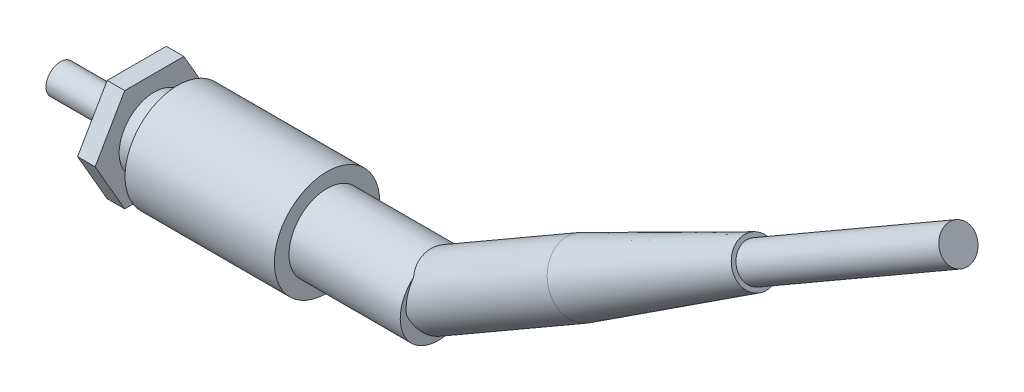
ISO-10303-21;
HEADER;
FILE_DESCRIPTION(('STEP AP214'),'2;1');
FILE_NAME('part.step','',(''),(''),'','','');
FILE_SCHEMA(('AUTOMOTIVE_DESIGN { 1 0 10303 214 1 1 1 1 }'));
ENDSEC;
DATA;
#1=APPLICATION_CONTEXT('core data for automotive mechanical design processes');
#2=APPLICATION_PROTOCOL_DEFINITION('international standard','automotive_design',2000,#1);
#3=PRODUCT_CONTEXT('',#1,'mechanical');
#4=PRODUCT('Part','Part','',(#3));
#5=PRODUCT_RELATED_PRODUCT_CATEGORY('part','',(#4));
#6=PRODUCT_DEFINITION_FORMATION('','',#4);
#7=PRODUCT_DEFINITION_CONTEXT('part definition',#1,'design');
#8=PRODUCT_DEFINITION('design','',#6,#7);
#9=PRODUCT_DEFINITION_SHAPE('','',#8);
#10=(LENGTH_UNIT() NAMED_UNIT(*) SI_UNIT(.MILLI.,.METRE.));
#11=(NAMED_UNIT(*) PLANE_ANGLE_UNIT() SI_UNIT($,.RADIAN.));
#12=(NAMED_UNIT(*) SI_UNIT($,.STERADIAN.) SOLID_ANGLE_UNIT());
#13=UNCERTAINTY_MEASURE_WITH_UNIT(LENGTH_MEASURE(1.E-05),#10,'distance_accuracy_value','');
#14=(GEOMETRIC_REPRESENTATION_CONTEXT(3) GLOBAL_UNCERTAINTY_ASSIGNED_CONTEXT((#13)) GLOBAL_UNIT_ASSIGNED_CONTEXT((#10,
#11,#12)) REPRESENTATION_CONTEXT('',''));
#15=CARTESIAN_POINT('',(0.,0.,0.));
#16=DIRECTION('',(0.,0.,1.));
#17=DIRECTION('',(1.,0.,0.));
#18=AXIS2_PLACEMENT_3D('',#15,#16,#17);
#19=CARTESIAN_POINT('',(55.6846004384196,32.1495190528384,0.));
#20=DIRECTION('',(0.866025403784438,0.500000000000001,0.));
#21=DIRECTION('',(-0.500000000000001,0.866025403784438,0.));
#22=AXIS2_PLACEMENT_3D('',#19,#20,#21);
#23=PLANE('',#22);
#24=CARTESIAN_POINT('',(55.6846004384196,32.1495190528384,0.));
#25=DIRECTION('',(0.866025403784438,0.500000000000001,0.));
#26=DIRECTION('',(-0.500000000000001,0.866025403784438,0.));
#27=AXIS2_PLACEMENT_3D('',#24,#25,#26);
#28=CIRCLE('',#27,3.7181355043766);
#29=CARTESIAN_POINT('',(53.8255326862313,35.3695188543414,0.));
#30=VERTEX_POINT('',#29);
#31=EDGE_CURVE('E236',#30,#30,#28,.T.);
#32=ORIENTED_EDGE('',*,*,#31,.T.);
#33=EDGE_LOOP('',(#32));
#34=FACE_BOUND('',#33,.T.);
#35=CARTESIAN_POINT('',(55.6846004384196,32.1495190528384,0.));
#36=DIRECTION('',(0.866025403784438,0.500000000000001,0.));
#37=DIRECTION('',(-0.500000000000001,0.866025403784438,0.));
#38=AXIS2_PLACEMENT_3D('',#35,#36,#37);
#39=CIRCLE('',#38,3.);
#40=CARTESIAN_POINT('',(54.1846004384196,34.7475952641917,0.));
#41=VERTEX_POINT('',#40);
#42=EDGE_CURVE('E241',#41,#41,#39,.T.);
#43=ORIENTED_EDGE('',*,*,#42,.F.);
#44=EDGE_LOOP('',(#43));
#45=FACE_BOUND('',#44,.T.);
#46=ADVANCED_FACE('F33',(#34,#45),#23,.T.);
#47=CARTESIAN_POINT('',(1.5,0.,0.));
#48=DIRECTION('',(-1.,0.,0.));
#49=DIRECTION('',(0.,0.,1.));
#50=AXIS2_PLACEMENT_3D('',#47,#48,#49);
#51=CYLINDRICAL_SURFACE('',#50,6.5);
#52=CARTESIAN_POINT('',(-17.5,0.,0.));
#53=DIRECTION('',(1.,0.,0.));
#54=DIRECTION('',(0.,0.,-1.));
#55=AXIS2_PLACEMENT_3D('',#52,#53,#54);
#56=CIRCLE('',#55,6.5);
#57=CARTESIAN_POINT('',(-17.5,0.,-6.5));
#58=VERTEX_POINT('',#57);
#59=EDGE_CURVE('E177',#58,#58,#56,.T.);
#60=ORIENTED_EDGE('',*,*,#59,.T.);
#61=EDGE_LOOP('',(#60));
#62=FACE_BOUND('',#61,.T.);
#63=CARTESIAN_POINT('',(1.5,4.95175822391743,-4.21071139973593));
#64=CARTESIAN_POINT('',(1.45853842631436,4.99062331245478,-4.1650096532007));
#65=CARTESIAN_POINT('',(1.41837234749256,5.02942063612896,-4.11809837839865));
#66=CARTESIAN_POINT('',(1.34054896259046,5.10663086172388,-4.02195444910145));
#67=CARTESIAN_POINT('',(1.30289122145795,5.14504382932101,-3.97272219970473));
#68=CARTESIAN_POINT('',(1.19361485509511,5.25927116972554,-3.82177448055468));
#69=CARTESIAN_POINT('',(1.1256041344466,5.334158769411,-3.71670916973631));
#70=CARTESIAN_POINT('',(0.998775676345337,5.4794768274095,-3.49891867933618));
#71=CARTESIAN_POINT('',(0.939929575740155,5.54992061906083,-3.38621874691166));
#72=CARTESIAN_POINT('',(0.830494880106282,5.68527889660248,-3.15368124049287));
#73=CARTESIAN_POINT('',(0.779907991796883,5.75019223833489,-3.03384219820759));
#74=CARTESIAN_POINT('',(0.686574625212133,5.87319896699451,-2.78825166985538));
#75=CARTESIAN_POINT('',(0.643806910333505,5.93131066749137,-2.66251739973733));
#76=CARTESIAN_POINT('',(0.565476196911716,6.04004669646886,-2.40567782781462));
#77=CARTESIAN_POINT('',(0.529913540283503,6.09067066958975,-2.27457227147115));
#78=CARTESIAN_POINT('',(0.465612895843669,6.1837516025861,-2.00778197491541));
#79=CARTESIAN_POINT('',(0.436878689128993,6.22620403519864,-1.8720947449757));
#80=CARTESIAN_POINT('',(0.385980373546201,6.30235701878118,-1.59707776686736));
#81=CARTESIAN_POINT('',(0.363816537253797,6.33605720665194,-1.4577478678413));
#82=CARTESIAN_POINT('',(0.324870285515014,6.39579806071961,-1.16902140802282));
#83=CARTESIAN_POINT('',(0.308426924446286,6.42135033847607,-1.01947772103524));
#84=CARTESIAN_POINT('',(0.282422162165123,6.46197282366687,-0.71833248255023));
#85=CARTESIAN_POINT('',(0.272863080600283,6.47703949793544,-0.566730254944936));
#86=CARTESIAN_POINT('',(0.260546876986866,6.49648095290198,-0.262587001801393));
#87=CARTESIAN_POINT('',(0.257788838757365,6.50085717372964,-0.1100461054887));
#88=CARTESIAN_POINT('',(0.259046725135916,6.49886564651953,0.194937781754197));
#89=CARTESIAN_POINT('',(0.26306268643043,6.49249784029452,0.347380772149692));
#90=CARTESIAN_POINT('',(0.277999240996901,6.46895217345386,0.653027741040311));
#91=CARTESIAN_POINT('',(0.289006176030697,6.45163914688937,0.806217114750533));
#92=CARTESIAN_POINT('',(0.318105416406996,6.40631803822907,1.11027369611098));
#93=CARTESIAN_POINT('',(0.33619547310409,6.37831335043512,1.26114162495736));
#94=CARTESIAN_POINT('',(0.379660325468286,6.3119638462661,1.55964987587544));
#95=CARTESIAN_POINT('',(0.40504104502565,6.2736106229281,1.70728746779088));
#96=CARTESIAN_POINT('',(0.463348956558489,6.18712119029717,1.99813594648287));
#97=CARTESIAN_POINT('',(0.496275838651767,6.138985382734,2.14134701476006));
#98=CARTESIAN_POINT('',(0.57001443309026,6.03369988425927,2.42217502535429));
#99=CARTESIAN_POINT('',(0.610819265365797,5.97655806652797,2.55979672303165));
#100=CARTESIAN_POINT('',(0.700815183397916,5.85416106821372,2.82853184487039));
#101=CARTESIAN_POINT('',(0.750005648470482,5.78890648821428,2.95964574979592));
#102=CARTESIAN_POINT('',(0.857266248127535,5.65160765973418,3.21405946960122));
#103=CARTESIAN_POINT('',(0.915316565169405,5.57957869873519,3.33737587604119));
#104=CARTESIAN_POINT('',(1.0410755271341,5.43011041721472,3.57541991107609));
#105=CARTESIAN_POINT('',(1.10877772352733,5.35267472647505,3.69015319673548));
#106=CARTESIAN_POINT('',(1.2300281046944,5.22095868682359,3.8729389643256));
#107=CARTESIAN_POINT('',(1.28064243808323,5.1676830134869,3.94367823055048));
#108=CARTESIAN_POINT('',(1.38666329073069,5.0602387428139,4.08063585407204));
#109=CARTESIAN_POINT('',(1.44206642410676,5.00607079793296,4.14685734729959));
#110=CARTESIAN_POINT('',(1.5,4.95175822391743,4.21071139973593));
#111=B_SPLINE_CURVE_WITH_KNOTS('',3,(#63,#64,#65,#66,#67,#68,#69,#70,#71,#72,#73,#74,#75,#76,
#77,#78,#79,#80,#81,#82,#83,#84,#85,#86,#87,#88,#89,#90,#91,#92,#93,#94,#95,#96,#97,#98,#99,
#100,#101,#102,#103,#104,#105,#106,#107,#108,#109,#110),.UNSPECIFIED.,.F.,.F.,(4,2,2,2,2,2,2,2,
2,2,2,2,2,2,2,2,2,2,2,2,2,2,2,4),(0.,0.218730219359793,0.437422402297116,0.8743354431036,
1.30986821495744,1.74549087358328,2.17991222636389,2.61435418971785,3.04903615767995,
3.48373615615838,3.94100036111628,4.39841856856375,4.85577515300501,5.31313421439496,
5.77625472087053,6.2392283217031,6.70257917224506,7.16591099875205,7.62883999813636,
8.09173474751477,8.55360887981437,9.01517586248303,9.32097676304259,9.62656319100676),.UNSPECIFIED.);
#112=CARTESIAN_POINT('',(1.5,4.95175822391743,-4.21071139973593));
#113=VERTEX_POINT('',#112);
#114=CARTESIAN_POINT('',(1.5,4.95175822391743,4.21071139973593));
#115=VERTEX_POINT('',#114);
#116=EDGE_CURVE('E170',#113,#115,#111,.T.);
#117=ORIENTED_EDGE('',*,*,#116,.F.);
#118=CARTESIAN_POINT('',(1.5,0.,0.));
#119=DIRECTION('',(1.,0.,0.));
#120=DIRECTION('',(0.,0.,-1.));
#121=AXIS2_PLACEMENT_3D('',#118,#119,#120);
#122=CIRCLE('',#121,6.5);
#123=EDGE_CURVE('E163',#115,#113,#122,.T.);
#124=ORIENTED_EDGE('',*,*,#123,.F.);
#125=EDGE_LOOP('',(#117,#124));
#126=FACE_BOUND('',#125,.T.);
#127=ADVANCED_FACE('F172',(#62,#126),#51,.T.);
#128=CARTESIAN_POINT('',(1.5,0.,0.));
#129=DIRECTION('',(1.,0.,0.));
#130=DIRECTION('',(0.,0.,-1.));
#131=AXIS2_PLACEMENT_3D('',#128,#129,#130);
#132=PLANE('',#131);
#133=DIRECTION('',(0.,0.,1.));
#134=VECTOR('',#133,1.);
#135=CARTESIAN_POINT('',(1.5,0.,0.));
#136=LINE('',#135,#134);
#137=CARTESIAN_POINT('',(1.5,0.,-5.44862367942584));
#138=VERTEX_POINT('',#137);
#139=CARTESIAN_POINT('',(1.5,0.,5.44862367942584));
#140=VERTEX_POINT('',#139);
#141=EDGE_CURVE('E153',#138,#140,#136,.T.);
#142=ORIENTED_EDGE('',*,*,#141,.T.);
#143=CARTESIAN_POINT('',(1.5,0.866025403784443,0.));
#144=DIRECTION('',(1.,0.,0.));
#145=DIRECTION('',(0.,-1.,0.));
#146=AXIS2_PLACEMENT_3D('',#143,#144,#145);
#147=ELLIPSE('',#146,6.35085296108589,5.5);
#148=EDGE_CURVE('E11',#140,#115,#147,.F.);
#149=ORIENTED_EDGE('',*,*,#148,.T.);
#150=ORIENTED_EDGE('',*,*,#123,.T.);
#151=EDGE_CURVE('E37',#113,#138,#147,.F.);
#152=ORIENTED_EDGE('',*,*,#151,.T.);
#153=EDGE_LOOP('',(#142,#149,#150,#152));
#154=FACE_BOUND('',#153,.T.);
#155=ADVANCED_FACE('F160',(#154),#132,.T.);
#156=CARTESIAN_POINT('',(-50.,8.75,5.05181485540922));
#157=DIRECTION('',(1.,0.,0.));
#158=DIRECTION('',(0.,0.,-1.));
#159=AXIS2_PLACEMENT_3D('',#156,#157,#158);
#160=PLANE('',#159);
#161=DIRECTION('',(0.,0.,1.));
#162=VECTOR('',#161,1.);
#163=CARTESIAN_POINT('',(-50.,8.75,-5.05181485540923));
#164=LINE('',#163,#162);
#165=CARTESIAN_POINT('',(-50.,8.75,-5.05181485540923));
#166=VERTEX_POINT('',#165);
#167=CARTESIAN_POINT('',(-50.,8.75,5.05181485540922));
#168=VERTEX_POINT('',#167);
#169=EDGE_CURVE('E130',#166,#168,#164,.T.);
#170=ORIENTED_EDGE('',*,*,#169,.F.);
#171=DIRECTION('',(0.,0.866025403784439,0.5));
#172=VECTOR('',#171,1.);
#173=CARTESIAN_POINT('',(-50.,0.,-10.1036297108185));
#174=LINE('',#173,#172);
#175=CARTESIAN_POINT('',(-50.,0.,-10.1036297108185));
#176=VERTEX_POINT('',#175);
#177=EDGE_CURVE('E83',#176,#166,#174,.T.);
#178=ORIENTED_EDGE('',*,*,#177,.F.);
#179=DIRECTION('',(0.,0.866025403784438,-0.5));
#180=VECTOR('',#179,1.);
#181=CARTESIAN_POINT('',(-50.,-8.75,-5.05181485540922));
#182=LINE('',#181,#180);
#183=CARTESIAN_POINT('',(-50.,-8.75,-5.05181485540922));
#184=VERTEX_POINT('',#183);
#185=EDGE_CURVE('E139',#184,#176,#182,.T.);
#186=ORIENTED_EDGE('',*,*,#185,.F.);
#187=DIRECTION('',(0.,0.,-1.));
#188=VECTOR('',#187,1.);
#189=CARTESIAN_POINT('',(-50.,-8.74999999999999,5.05181485540923));
#190=LINE('',#189,#188);
#191=CARTESIAN_POINT('',(-50.,-8.74999999999999,5.05181485540923));
#192=VERTEX_POINT('',#191);
#193=EDGE_CURVE('E118',#192,#184,#190,.T.);
#194=ORIENTED_EDGE('',*,*,#193,.F.);
#195=DIRECTION('',(0.,-0.866025403784439,-0.5));
#196=VECTOR('',#195,1.);
#197=CARTESIAN_POINT('',(-50.,0.,10.1036297108185));
#198=LINE('',#197,#196);
#199=CARTESIAN_POINT('',(-50.,0.,10.1036297108185));
#200=VERTEX_POINT('',#199);
#201=EDGE_CURVE('E136',#200,#192,#198,.T.);
#202=ORIENTED_EDGE('',*,*,#201,.F.);
#203=DIRECTION('',(0.,-0.866025403784439,0.5));
#204=VECTOR('',#203,1.);
#205=CARTESIAN_POINT('',(-50.,8.75,5.05181485540922));
#206=LINE('',#205,#204);
#207=EDGE_CURVE('E133',#168,#200,#206,.T.);
#208=ORIENTED_EDGE('',*,*,#207,.F.);
#209=EDGE_LOOP('',(#170,#178,#186,#194,#202,#208));
#210=FACE_BOUND('',#209,.T.);
#211=CARTESIAN_POINT('',(-50.,0.,0.));
#212=DIRECTION('',(1.,0.,0.));
#213=DIRECTION('',(0.,0.,-1.));
#214=AXIS2_PLACEMENT_3D('',#211,#212,#213);
#215=CIRCLE('',#214,2.5);
#216=CARTESIAN_POINT('',(-50.,0.,-2.5));
#217=VERTEX_POINT('',#216);
#218=EDGE_CURVE('E151',#217,#217,#215,.F.);
#219=ORIENTED_EDGE('',*,*,#218,.F.);
#220=EDGE_LOOP('',(#219));
#221=FACE_BOUND('',#220,.T.);
#222=ADVANCED_FACE('F206',(#210,#221),#160,.F.);
#223=CARTESIAN_POINT('',(-17.5,0.,0.));
#224=DIRECTION('',(1.,0.,0.));
#225=DIRECTION('',(0.,0.,-1.));
#226=AXIS2_PLACEMENT_3D('',#223,#224,#225);
#227=PLANE('',#226);
#228=CARTESIAN_POINT('',(-17.5,0.,0.));
#229=DIRECTION('',(1.,0.,0.));
#230=DIRECTION('',(0.,0.,-1.));
#231=AXIS2_PLACEMENT_3D('',#228,#229,#230);
#232=CIRCLE('',#231,9.);
#233=CARTESIAN_POINT('',(-17.5,0.,-9.));
#234=VERTEX_POINT('',#233);
#235=EDGE_CURVE('E415',#234,#234,#232,.T.);
#236=ORIENTED_EDGE('',*,*,#235,.T.);
#237=EDGE_LOOP('',(#236));
#238=FACE_BOUND('',#237,.T.);
#239=ORIENTED_EDGE('',*,*,#59,.F.);
#240=EDGE_LOOP('',(#239));
#241=FACE_BOUND('',#240,.T.);
#242=ADVANCED_FACE('F211',(#238,#241),#227,.T.);
#243=CARTESIAN_POINT('',(-47.,8.75,5.05181485540922));
#244=DIRECTION('',(1.,0.,0.));
#245=DIRECTION('',(0.,0.,-1.));
#246=AXIS2_PLACEMENT_3D('',#243,#244,#245);
#247=PLANE('',#246);
#248=DIRECTION('',(0.,0.,1.));
#249=VECTOR('',#248,1.);
#250=CARTESIAN_POINT('',(-47.,8.75,-5.05181485540923));
#251=LINE('',#250,#249);
#252=CARTESIAN_POINT('',(-47.,8.75,-5.05181485540923));
#253=VERTEX_POINT('',#252);
#254=CARTESIAN_POINT('',(-47.,8.75,5.05181485540922));
#255=VERTEX_POINT('',#254);
#256=EDGE_CURVE('E142',#253,#255,#251,.T.);
#257=ORIENTED_EDGE('',*,*,#256,.T.);
#258=DIRECTION('',(0.,-0.866025403784439,0.5));
#259=VECTOR('',#258,1.);
#260=CARTESIAN_POINT('',(-47.,8.75,5.05181485540922));
#261=LINE('',#260,#259);
#262=CARTESIAN_POINT('',(-47.,0.,10.1036297108185));
#263=VERTEX_POINT('',#262);
#264=EDGE_CURVE('E92',#255,#263,#261,.T.);
#265=ORIENTED_EDGE('',*,*,#264,.T.);
#266=DIRECTION('',(0.,-0.866025403784439,-0.5));
#267=VECTOR('',#266,1.);
#268=CARTESIAN_POINT('',(-47.,0.,10.1036297108185));
#269=LINE('',#268,#267);
#270=CARTESIAN_POINT('',(-47.,-8.74999999999999,5.05181485540923));
#271=VERTEX_POINT('',#270);
#272=EDGE_CURVE('E109',#263,#271,#269,.T.);
#273=ORIENTED_EDGE('',*,*,#272,.T.);
#274=DIRECTION('',(0.,0.,-1.));
#275=VECTOR('',#274,1.);
#276=CARTESIAN_POINT('',(-47.,-8.74999999999999,5.05181485540923));
#277=LINE('',#276,#275);
#278=CARTESIAN_POINT('',(-47.,-8.75,-5.05181485540922));
#279=VERTEX_POINT('',#278);
#280=EDGE_CURVE('E101',#271,#279,#277,.T.);
#281=ORIENTED_EDGE('',*,*,#280,.T.);
#282=DIRECTION('',(0.,0.866025403784438,-0.5));
#283=VECTOR('',#282,1.);
#284=CARTESIAN_POINT('',(-47.,-8.75,-5.05181485540922));
#285=LINE('',#284,#283);
#286=CARTESIAN_POINT('',(-47.,0.,-10.1036297108185));
#287=VERTEX_POINT('',#286);
#288=EDGE_CURVE('E106',#279,#287,#285,.T.);
#289=ORIENTED_EDGE('',*,*,#288,.T.);
#290=DIRECTION('',(0.,0.866025403784439,0.5));
#291=VECTOR('',#290,1.);
#292=CARTESIAN_POINT('',(-47.,0.,-10.1036297108185));
#293=LINE('',#292,#291);
#294=EDGE_CURVE('E56',#287,#253,#293,.T.);
#295=ORIENTED_EDGE('',*,*,#294,.T.);
#296=EDGE_LOOP('',(#257,#265,#273,#281,#289,#295));
#297=FACE_BOUND('',#296,.T.);
#298=CARTESIAN_POINT('',(-47.,0.,0.));
#299=DIRECTION('',(1.,0.,0.));
#300=DIRECTION('',(0.,0.,-1.));
#301=AXIS2_PLACEMENT_3D('',#298,#299,#300);
#302=CIRCLE('',#301,6.);
#303=CARTESIAN_POINT('',(-47.,0.,-6.));
#304=VERTEX_POINT('',#303);
#305=EDGE_CURVE('E412',#304,#304,#302,.T.);
#306=ORIENTED_EDGE('',*,*,#305,.F.);
#307=EDGE_LOOP('',(#306));
#308=FACE_BOUND('',#307,.T.);
#309=ADVANCED_FACE('F103',(#297,#308),#247,.T.);
#310=CARTESIAN_POINT('',(-47.,8.75,-5.05181485540923));
#311=DIRECTION('',(0.,-1.,0.));
#312=DIRECTION('',(0.,0.,-1.));
#313=AXIS2_PLACEMENT_3D('',#310,#311,#312);
#314=PLANE('',#313);
#315=ORIENTED_EDGE('',*,*,#169,.T.);
#316=DIRECTION('',(-1.,0.,0.));
#317=VECTOR('',#316,1.);
#318=CARTESIAN_POINT('',(-47.,8.75,5.05181485540922));
#319=LINE('',#318,#317);
#320=EDGE_CURVE('E149',#255,#168,#319,.T.);
#321=ORIENTED_EDGE('',*,*,#320,.F.);
#322=ORIENTED_EDGE('',*,*,#256,.F.);
#323=DIRECTION('',(-1.,0.,0.));
#324=VECTOR('',#323,1.);
#325=CARTESIAN_POINT('',(-47.,8.75,-5.05181485540923));
#326=LINE('',#325,#324);
#327=EDGE_CURVE('E126',#253,#166,#326,.T.);
#328=ORIENTED_EDGE('',*,*,#327,.T.);
#329=EDGE_LOOP('',(#315,#321,#322,#328));
#330=FACE_BOUND('',#329,.T.);
#331=ADVANCED_FACE('F35',(#330),#314,.F.);
#332=CARTESIAN_POINT('',(-47.,8.75,5.05181485540922));
#333=DIRECTION('',(0.,-0.5,-0.866025403784438));
#334=DIRECTION('',(0.,0.866025403784439,-0.5));
#335=AXIS2_PLACEMENT_3D('',#332,#333,#334);
#336=PLANE('',#335);
#337=ORIENTED_EDGE('',*,*,#207,.T.);
#338=DIRECTION('',(-1.,0.,0.));
#339=VECTOR('',#338,1.);
#340=CARTESIAN_POINT('',(-47.,0.,10.1036297108185));
#341=LINE('',#340,#339);
#342=EDGE_CURVE('E146',#263,#200,#341,.T.);
#343=ORIENTED_EDGE('',*,*,#342,.F.);
#344=ORIENTED_EDGE('',*,*,#264,.F.);
#345=ORIENTED_EDGE('',*,*,#320,.T.);
#346=EDGE_LOOP('',(#337,#343,#344,#345));
#347=FACE_BOUND('',#346,.T.);
#348=ADVANCED_FACE('F385',(#347),#336,.F.);
#349=CARTESIAN_POINT('',(-47.,0.,10.1036297108185));
#350=DIRECTION('',(0.,0.5,-0.866025403784439));
#351=DIRECTION('',(0.,0.866025403784439,0.5));
#352=AXIS2_PLACEMENT_3D('',#349,#350,#351);
#353=PLANE('',#352);
#354=ORIENTED_EDGE('',*,*,#201,.T.);
#355=DIRECTION('',(-1.,0.,0.));
#356=VECTOR('',#355,1.);
#357=CARTESIAN_POINT('',(-47.,-8.74999999999999,5.05181485540923));
#358=LINE('',#357,#356);
#359=EDGE_CURVE('E121',#271,#192,#358,.T.);
#360=ORIENTED_EDGE('',*,*,#359,.F.);
#361=ORIENTED_EDGE('',*,*,#272,.F.);
#362=ORIENTED_EDGE('',*,*,#342,.T.);
#363=EDGE_LOOP('',(#354,#360,#361,#362));
#364=FACE_BOUND('',#363,.T.);
#365=ADVANCED_FACE('F376',(#364),#353,.F.);
#366=CARTESIAN_POINT('',(-47.,-8.74999999999999,5.05181485540923));
#367=DIRECTION('',(0.,1.,0.));
#368=DIRECTION('',(0.,0.,1.));
#369=AXIS2_PLACEMENT_3D('',#366,#367,#368);
#370=PLANE('',#369);
#371=ORIENTED_EDGE('',*,*,#193,.T.);
#372=DIRECTION('',(-1.,0.,0.));
#373=VECTOR('',#372,1.);
#374=CARTESIAN_POINT('',(-47.,-8.75,-5.05181485540922));
#375=LINE('',#374,#373);
#376=EDGE_CURVE('E115',#279,#184,#375,.T.);
#377=ORIENTED_EDGE('',*,*,#376,.F.);
#378=ORIENTED_EDGE('',*,*,#280,.F.);
#379=ORIENTED_EDGE('',*,*,#359,.T.);
#380=EDGE_LOOP('',(#371,#377,#378,#379));
#381=FACE_BOUND('',#380,.T.);
#382=ADVANCED_FACE('F116',(#381),#370,.F.);
#383=CARTESIAN_POINT('',(-47.,-8.75,-5.05181485540922));
#384=DIRECTION('',(0.,0.5,0.866025403784438));
#385=DIRECTION('',(0.,-0.866025403784438,0.5));
#386=AXIS2_PLACEMENT_3D('',#383,#384,#385);
#387=PLANE('',#386);
#388=ORIENTED_EDGE('',*,*,#185,.T.);
#389=DIRECTION('',(-1.,0.,0.));
#390=VECTOR('',#389,1.);
#391=CARTESIAN_POINT('',(-47.,0.,-10.1036297108185));
#392=LINE('',#391,#390);
#393=EDGE_CURVE('E122',#287,#176,#392,.T.);
#394=ORIENTED_EDGE('',*,*,#393,.F.);
#395=ORIENTED_EDGE('',*,*,#288,.F.);
#396=ORIENTED_EDGE('',*,*,#376,.T.);
#397=EDGE_LOOP('',(#388,#394,#395,#396));
#398=FACE_BOUND('',#397,.T.);
#399=ADVANCED_FACE('F124',(#398),#387,.F.);
#400=CARTESIAN_POINT('',(-47.,0.,-10.1036297108185));
#401=DIRECTION('',(0.,-0.5,0.866025403784439));
#402=DIRECTION('',(0.,-0.866025403784439,-0.5));
#403=AXIS2_PLACEMENT_3D('',#400,#401,#402);
#404=PLANE('',#403);
#405=ORIENTED_EDGE('',*,*,#177,.T.);
#406=ORIENTED_EDGE('',*,*,#327,.F.);
#407=ORIENTED_EDGE('',*,*,#294,.F.);
#408=ORIENTED_EDGE('',*,*,#393,.T.);
#409=EDGE_LOOP('',(#405,#406,#407,#408));
#410=FACE_BOUND('',#409,.T.);
#411=ADVANCED_FACE('F342',(#410),#404,.F.);
#412=CARTESIAN_POINT('',(-43.,0.,0.));
#413=DIRECTION('',(-1.,0.,0.));
#414=DIRECTION('',(0.,0.,1.));
#415=AXIS2_PLACEMENT_3D('',#412,#413,#414);
#416=CYLINDRICAL_SURFACE('',#415,6.);
#417=CARTESIAN_POINT('',(-43.,0.,0.));
#418=DIRECTION('',(1.,0.,0.));
#419=DIRECTION('',(0.,0.,-1.));
#420=AXIS2_PLACEMENT_3D('',#417,#418,#419);
#421=CIRCLE('',#420,6.);
#422=CARTESIAN_POINT('',(-43.,0.,-6.));
#423=VERTEX_POINT('',#422);
#424=EDGE_CURVE('E134',#423,#423,#421,.T.);
#425=ORIENTED_EDGE('',*,*,#424,.F.);
#426=EDGE_LOOP('',(#425));
#427=FACE_BOUND('',#426,.T.);
#428=ORIENTED_EDGE('',*,*,#305,.T.);
#429=EDGE_LOOP('',(#428));
#430=FACE_BOUND('',#429,.T.);
#431=ADVANCED_FACE('F332',(#427,#430),#416,.T.);
#432=CARTESIAN_POINT('',(-43.,0.,0.));
#433=DIRECTION('',(1.,0.,0.));
#434=DIRECTION('',(0.,0.,-1.));
#435=AXIS2_PLACEMENT_3D('',#432,#433,#434);
#436=PLANE('',#435);
#437=CARTESIAN_POINT('',(-43.,0.,0.));
#438=DIRECTION('',(1.,0.,0.));
#439=DIRECTION('',(0.,0.,-1.));
#440=AXIS2_PLACEMENT_3D('',#437,#438,#439);
#441=CIRCLE('',#440,9.);
#442=CARTESIAN_POINT('',(-43.,0.,-9.));
#443=VERTEX_POINT('',#442);
#444=EDGE_CURVE('E418',#443,#443,#441,.T.);
#445=ORIENTED_EDGE('',*,*,#444,.F.);
#446=EDGE_LOOP('',(#445));
#447=FACE_BOUND('',#446,.T.);
#448=ORIENTED_EDGE('',*,*,#424,.T.);
#449=EDGE_LOOP('',(#448));
#450=FACE_BOUND('',#449,.T.);
#451=ADVANCED_FACE('F322',(#447,#450),#436,.F.);
#452=CARTESIAN_POINT('',(-17.5,0.,0.));
#453=DIRECTION('',(-1.,0.,0.));
#454=DIRECTION('',(0.,0.,1.));
#455=AXIS2_PLACEMENT_3D('',#452,#453,#454);
#456=CYLINDRICAL_SURFACE('',#455,9.);
#457=ORIENTED_EDGE('',*,*,#235,.F.);
#458=EDGE_LOOP('',(#457));
#459=FACE_BOUND('',#458,.T.);
#460=ORIENTED_EDGE('',*,*,#444,.T.);
#461=EDGE_LOOP('',(#460));
#462=FACE_BOUND('',#461,.T.);
#463=ADVANCED_FACE('F203',(#459,#462),#456,.T.);
#464=CARTESIAN_POINT('',(-63.,0.,0.));
#465=DIRECTION('',(1.,0.,0.));
#466=DIRECTION('',(0.,0.,-1.));
#467=AXIS2_PLACEMENT_3D('',#464,#465,#466);
#468=CYLINDRICAL_SURFACE('',#467,2.5);
#469=CARTESIAN_POINT('',(-63.,0.,0.));
#470=DIRECTION('',(-1.,0.,0.));
#471=DIRECTION('',(0.,0.,1.));
#472=AXIS2_PLACEMENT_3D('',#469,#470,#471);
#473=CIRCLE('',#472,2.5);
#474=CARTESIAN_POINT('',(-63.,0.,-2.5));
#475=VERTEX_POINT('',#474);
#476=EDGE_CURVE('E173',#475,#475,#473,.T.);
#477=CARTESIAN_POINT('',(-63.,0.,-2.5));
#478=CARTESIAN_POINT('',(-62.8645833333333,0.,-2.5));
#479=CARTESIAN_POINT('',(-62.7291666666667,0.,-2.5));
#480=CARTESIAN_POINT('',(-62.4583333333333,0.,-2.5));
#481=CARTESIAN_POINT('',(-62.3229166666667,0.,-2.5));
#482=CARTESIAN_POINT('',(-62.0520833333333,0.,-2.5));
#483=CARTESIAN_POINT('',(-61.9166666666667,0.,-2.5));
#484=CARTESIAN_POINT('',(-61.6458333333333,0.,-2.5));
#485=CARTESIAN_POINT('',(-61.5104166666667,0.,-2.5));
#486=CARTESIAN_POINT('',(-61.2395833333333,0.,-2.5));
#487=CARTESIAN_POINT('',(-61.1041666666667,0.,-2.5));
#488=CARTESIAN_POINT('',(-60.8333333333333,0.,-2.5));
#489=CARTESIAN_POINT('',(-60.6979166666667,0.,-2.5));
#490=CARTESIAN_POINT('',(-60.4270833333333,0.,-2.5));
#491=CARTESIAN_POINT('',(-60.2916666666667,0.,-2.5));
#492=CARTESIAN_POINT('',(-60.0208333333333,0.,-2.5));
#493=CARTESIAN_POINT('',(-59.8854166666667,0.,-2.5));
#494=CARTESIAN_POINT('',(-59.6145833333333,0.,-2.5));
#495=CARTESIAN_POINT('',(-59.4791666666667,0.,-2.5));
#496=CARTESIAN_POINT('',(-59.2083333333333,0.,-2.5));
#497=CARTESIAN_POINT('',(-59.0729166666667,0.,-2.5));
#498=CARTESIAN_POINT('',(-58.8020833333333,0.,-2.5));
#499=CARTESIAN_POINT('',(-58.6666666666667,0.,-2.5));
#500=CARTESIAN_POINT('',(-58.3958333333333,0.,-2.5));
#501=CARTESIAN_POINT('',(-58.2604166666667,0.,-2.5));
#502=CARTESIAN_POINT('',(-57.9895833333333,0.,-2.5));
#503=CARTESIAN_POINT('',(-57.8541666666667,0.,-2.5));
#504=CARTESIAN_POINT('',(-57.5833333333333,0.,-2.5));
#505=CARTESIAN_POINT('',(-57.4479166666667,0.,-2.5));
#506=CARTESIAN_POINT('',(-57.1770833333333,0.,-2.5));
#507=CARTESIAN_POINT('',(-57.0416666666667,0.,-2.5));
#508=CARTESIAN_POINT('',(-56.7708333333333,0.,-2.5));
#509=CARTESIAN_POINT('',(-56.6354166666667,0.,-2.5));
#510=CARTESIAN_POINT('',(-56.3645833333333,0.,-2.5));
#511=CARTESIAN_POINT('',(-56.2291666666667,0.,-2.5));
#512=CARTESIAN_POINT('',(-55.9583333333333,0.,-2.5));
#513=CARTESIAN_POINT('',(-55.8229166666667,0.,-2.5));
#514=CARTESIAN_POINT('',(-55.5520833333333,0.,-2.5));
#515=CARTESIAN_POINT('',(-55.4166666666667,0.,-2.5));
#516=CARTESIAN_POINT('',(-55.1458333333333,0.,-2.5));
#517=CARTESIAN_POINT('',(-55.0104166666667,0.,-2.5));
#518=CARTESIAN_POINT('',(-54.7395833333333,0.,-2.5));
#519=CARTESIAN_POINT('',(-54.6041666666667,0.,-2.5));
#520=CARTESIAN_POINT('',(-54.3333333333333,0.,-2.5));
#521=CARTESIAN_POINT('',(-54.1979166666667,0.,-2.5));
#522=CARTESIAN_POINT('',(-53.9270833333333,0.,-2.5));
#523=CARTESIAN_POINT('',(-53.7916666666667,0.,-2.5));
#524=CARTESIAN_POINT('',(-53.5208333333333,0.,-2.5));
#525=CARTESIAN_POINT('',(-53.3854166666667,0.,-2.5));
#526=CARTESIAN_POINT('',(-53.1145833333333,0.,-2.5));
#527=CARTESIAN_POINT('',(-52.9791666666667,0.,-2.5));
#528=CARTESIAN_POINT('',(-52.7083333333333,0.,-2.5));
#529=CARTESIAN_POINT('',(-52.5729166666667,0.,-2.5));
#530=CARTESIAN_POINT('',(-52.3020833333333,0.,-2.5));
#531=CARTESIAN_POINT('',(-52.1666666666667,0.,-2.5));
#532=CARTESIAN_POINT('',(-51.8958333333333,0.,-2.5));
#533=CARTESIAN_POINT('',(-51.7604166666667,0.,-2.5));
#534=CARTESIAN_POINT('',(-51.4895833333333,0.,-2.5));
#535=CARTESIAN_POINT('',(-51.3541666666667,0.,-2.5));
#536=CARTESIAN_POINT('',(-51.0833333333333,0.,-2.5));
#537=CARTESIAN_POINT('',(-50.9479166666667,0.,-2.5));
#538=CARTESIAN_POINT('',(-50.6770833333333,0.,-2.5));
#539=CARTESIAN_POINT('',(-50.5416666666667,0.,-2.5));
#540=CARTESIAN_POINT('',(-50.2708333333333,0.,-2.5));
#541=CARTESIAN_POINT('',(-50.1354166666667,0.,-2.5));
#542=CARTESIAN_POINT('',(-50.,0.,-2.5));
#543=B_SPLINE_CURVE_WITH_KNOTS('',3,(#477,#478,#479,#480,#481,#482,#483,#484,#485,#486,#487,
#488,#489,#490,#491,#492,#493,#494,#495,#496,#497,#498,#499,#500,#501,#502,#503,#504,#505,#506,
#507,#508,#509,#510,#511,#512,#513,#514,#515,#516,#517,#518,#519,#520,#521,#522,#523,#524,#525,
#526,#527,#528,#529,#530,#531,#532,#533,#534,#535,#536,#537,#538,#539,#540,#541,#542),
.UNSPECIFIED.,.F.,.F.,(4,2,2,2,2,2,2,2,2,2,2,2,2,2,2,2,2,2,2,2,2,2,2,2,2,2,2,2,2,2,2,2,4),(0.,
0.406249999999997,0.812499999999994,1.21874999999999,1.62499999999999,2.03124999999999,
2.43749999999999,2.84374999999999,3.24999999999999,3.65624999999999,4.06249999999999,
4.46874999999999,4.87499999999999,5.28124999999999,5.68749999999998,6.09374999999999,
6.49999999999998,6.90624999999999,7.31249999999999,7.71874999999998,8.12499999999998,
8.53124999999998,8.93749999999998,9.34374999999998,9.74999999999998,10.15625,10.5625,10.96875,
11.375,11.78125,12.1875,12.59375,13.),.UNSPECIFIED.);
#544=EDGE_CURVE('BSEAM200',#475,#217,#543,.T.);
#545=ORIENTED_EDGE('',*,*,#476,.F.);
#546=ORIENTED_EDGE('',*,*,#218,.T.);
#547=ORIENTED_EDGE('',*,*,#544,.T.);
#548=ORIENTED_EDGE('',*,*,#544,.F.);
#549=EDGE_LOOP('',(#545,#547,#546,#548));
#550=FACE_BOUND('',#549,.T.);
#551=ADVANCED_FACE('F200',(#550),#468,.T.);
#552=CARTESIAN_POINT('',(-63.,0.,0.));
#553=DIRECTION('',(-1.,0.,0.));
#554=DIRECTION('',(0.,0.,1.));
#555=AXIS2_PLACEMENT_3D('',#552,#553,#554);
#556=PLANE('',#555);
#557=ORIENTED_EDGE('',*,*,#476,.T.);
#558=EDGE_LOOP('',(#557));
#559=FACE_BOUND('',#558,.T.);
#560=ADVANCED_FACE('F196',(#559),#556,.T.);
#561=CARTESIAN_POINT('',(26.2397367097487,15.1495190528384,0.));
#562=DIRECTION('',(-0.866025403784438,-0.500000000000001,0.));
#563=DIRECTION('',(0.500000000000001,-0.866025403784438,0.));
#564=AXIS2_PLACEMENT_3D('',#561,#562,#563);
#565=CYLINDRICAL_SURFACE('',#564,5.5);
#566=ORIENTED_EDGE('',*,*,#148,.F.);
#567=CARTESIAN_POINT('',(1.125,0.649519052838331,0.));
#568=DIRECTION('',(0.866025403784438,0.500000000000001,0.));
#569=DIRECTION('',(-0.500000000000001,0.866025403784438,0.));
#570=AXIS2_PLACEMENT_3D('',#567,#568,#569);
#571=CIRCLE('',#570,5.5);
#572=EDGE_CURVE('E47',#140,#138,#571,.T.);
#573=ORIENTED_EDGE('',*,*,#572,.T.);
#574=ORIENTED_EDGE('',*,*,#151,.F.);
#575=ORIENTED_EDGE('',*,*,#116,.T.);
#576=EDGE_LOOP('',(#566,#573,#574,#575));
#577=FACE_BOUND('',#576,.T.);
#578=CARTESIAN_POINT('',(26.2397367097487,15.1495190528384,0.));
#579=DIRECTION('',(0.866025403784438,0.500000000000001,0.));
#580=DIRECTION('',(-0.500000000000001,0.866025403784438,0.));
#581=AXIS2_PLACEMENT_3D('',#578,#579,#580);
#582=CIRCLE('',#581,5.5);
#583=CARTESIAN_POINT('',(23.4897367097487,19.9126587736528,0.));
#584=VERTEX_POINT('',#583);
#585=EDGE_CURVE('E174',#584,#584,#582,.T.);
#586=ORIENTED_EDGE('',*,*,#585,.F.);
#587=EDGE_LOOP('',(#586));
#588=FACE_BOUND('',#587,.T.);
#589=ADVANCED_FACE('F168',(#577,#588),#565,.T.);
#590=CARTESIAN_POINT('',(1.125,0.649519052838331,0.));
#591=DIRECTION('',(0.866025403784438,0.500000000000001,0.));
#592=DIRECTION('',(-0.500000000000001,0.866025403784438,0.));
#593=AXIS2_PLACEMENT_3D('',#590,#591,#592);
#594=PLANE('',#593);
#595=ORIENTED_EDGE('',*,*,#141,.F.);
#596=ORIENTED_EDGE('',*,*,#572,.F.);
#597=EDGE_LOOP('',(#595,#596));
#598=FACE_BOUND('',#597,.T.);
#599=ADVANCED_FACE('F195',(#598),#594,.F.);
#600=CARTESIAN_POINT('',(26.2397367097487,15.1495190528384,0.));
#601=DIRECTION('',(-0.866025403784438,-0.500000000000001,0.));
#602=DIRECTION('',(-0.500000000000001,0.866025403784438,0.));
#603=AXIS2_PLACEMENT_3D('',#600,#601,#602);
#604=CONICAL_SURFACE('',#603,5.5,0.05235987755983);
#605=ORIENTED_EDGE('',*,*,#31,.F.);
#606=EDGE_LOOP('',(#605));
#607=FACE_BOUND('',#606,.T.);
#608=ORIENTED_EDGE('',*,*,#585,.T.);
#609=EDGE_LOOP('',(#608));
#610=FACE_BOUND('',#609,.T.);
#611=ADVANCED_FACE('F225',(#607,#610),#604,.T.);
#612=CARTESIAN_POINT('',(90.3256165897971,52.1495190528385,0.));
#613=DIRECTION('',(-0.866025403784438,-0.500000000000001,0.));
#614=DIRECTION('',(0.500000000000001,-0.866025403784438,0.));
#615=AXIS2_PLACEMENT_3D('',#612,#613,#614);
#616=CYLINDRICAL_SURFACE('',#615,3.);
#617=CARTESIAN_POINT('',(90.3256165897971,52.1495190528385,0.));
#618=DIRECTION('',(0.866025403784438,0.500000000000001,0.));
#619=DIRECTION('',(-0.500000000000001,0.866025403784438,0.));
#620=AXIS2_PLACEMENT_3D('',#617,#618,#619);
#621=CIRCLE('',#620,3.);
#622=CARTESIAN_POINT('',(88.8256165897971,54.7475952641918,0.));
#623=VERTEX_POINT('',#622);
#624=EDGE_CURVE('E238',#623,#623,#621,.T.);
#625=ORIENTED_EDGE('',*,*,#624,.F.);
#626=EDGE_LOOP('',(#625));
#627=FACE_BOUND('',#626,.T.);
#628=ORIENTED_EDGE('',*,*,#42,.T.);
#629=EDGE_LOOP('',(#628));
#630=FACE_BOUND('',#629,.T.);
#631=ADVANCED_FACE('F223',(#627,#630),#616,.T.);
#632=CARTESIAN_POINT('',(90.3256165897971,52.1495190528385,0.));
#633=DIRECTION('',(0.866025403784438,0.500000000000001,0.));
#634=DIRECTION('',(-0.500000000000001,0.866025403784438,0.));
#635=AXIS2_PLACEMENT_3D('',#632,#633,#634);
#636=PLANE('',#635);
#637=ORIENTED_EDGE('',*,*,#624,.T.);
#638=EDGE_LOOP('',(#637));
#639=FACE_BOUND('',#638,.T.);
#640=ADVANCED_FACE('F232',(#639),#636,.T.);
#641=CLOSED_SHELL('',(#46,#127,#155,#222,#242,#309,#331,#348,#365,#382,#399,#411,#431,#451,#463,
#551,#560,#589,#599,#611,#631,#640));
#642=MANIFOLD_SOLID_BREP('B2',#641);
#643=ADVANCED_BREP_SHAPE_REPRESENTATION('',(#18,#642),#14);
#644=SHAPE_DEFINITION_REPRESENTATION(#9,#643);
ENDSEC;
END-ISO-10303-21;
